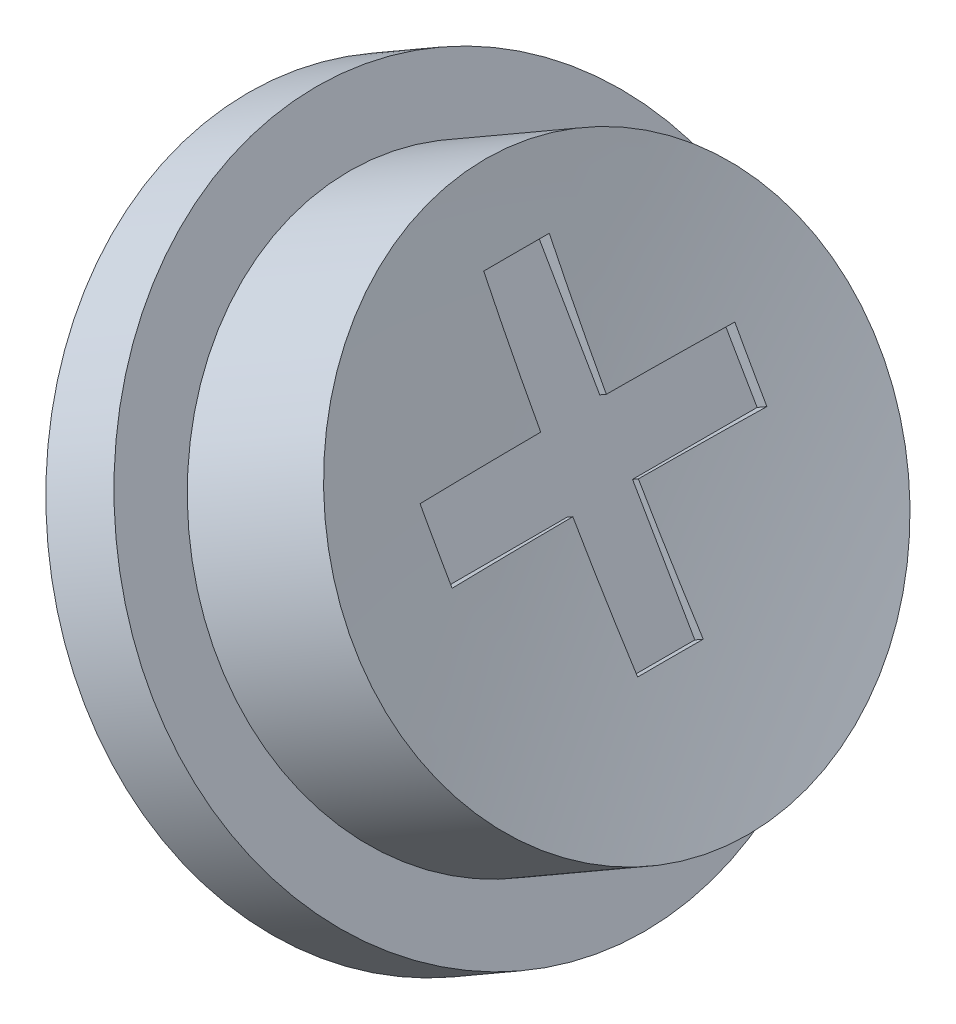
ISO-10303-21;
HEADER;
FILE_DESCRIPTION(('STEP AP214'),'2;1');
FILE_NAME('part.step','',(''),(''),'','','');
FILE_SCHEMA(('AUTOMOTIVE_DESIGN { 1 0 10303 214 1 1 1 1 }'));
ENDSEC;
DATA;
#1=APPLICATION_CONTEXT('core data for automotive mechanical design processes');
#2=APPLICATION_PROTOCOL_DEFINITION('international standard','automotive_design',2000,#1);
#3=PRODUCT_CONTEXT('',#1,'mechanical');
#4=PRODUCT('Part','Part','',(#3));
#5=PRODUCT_RELATED_PRODUCT_CATEGORY('part','',(#4));
#6=PRODUCT_DEFINITION_FORMATION('','',#4);
#7=PRODUCT_DEFINITION_CONTEXT('part definition',#1,'design');
#8=PRODUCT_DEFINITION('design','',#6,#7);
#9=PRODUCT_DEFINITION_SHAPE('','',#8);
#10=(LENGTH_UNIT() NAMED_UNIT(*) SI_UNIT(.MILLI.,.METRE.));
#11=(NAMED_UNIT(*) PLANE_ANGLE_UNIT() SI_UNIT($,.RADIAN.));
#12=(NAMED_UNIT(*) SI_UNIT($,.STERADIAN.) SOLID_ANGLE_UNIT());
#13=UNCERTAINTY_MEASURE_WITH_UNIT(LENGTH_MEASURE(1.E-05),#10,'distance_accuracy_value','');
#14=(GEOMETRIC_REPRESENTATION_CONTEXT(3) GLOBAL_UNCERTAINTY_ASSIGNED_CONTEXT((#13)) GLOBAL_UNIT_ASSIGNED_CONTEXT((#10,
#11,#12)) REPRESENTATION_CONTEXT('',''));
#15=CARTESIAN_POINT('',(0.,0.,0.));
#16=DIRECTION('',(0.,0.,1.));
#17=DIRECTION('',(1.,0.,0.));
#18=AXIS2_PLACEMENT_3D('',#15,#16,#17);
#19=CARTESIAN_POINT('',(54.5272413359522,-75.443952390439,0.));
#20=DIRECTION('',(-0.866025403784438,-0.500000000000001,0.));
#21=DIRECTION('',(0.500000000000001,-0.866025403784438,0.));
#22=AXIS2_PLACEMENT_3D('',#19,#20,#21);
#23=PLANE('',#22);
#24=CARTESIAN_POINT('',(54.5272413359522,-75.443952390439,0.));
#25=DIRECTION('',(0.866025403784438,0.500000000000001,0.));
#26=DIRECTION('',(-0.500000000000001,0.866025403784438,0.));
#27=AXIS2_PLACEMENT_3D('',#24,#25,#26);
#28=CIRCLE('',#27,2.);
#29=CARTESIAN_POINT('',(53.5272413359522,-73.7119015828702,0.));
#30=VERTEX_POINT('',#29);
#31=EDGE_CURVE('E219',#30,#30,#28,.T.);
#32=ORIENTED_EDGE('',*,*,#31,.F.);
#33=EDGE_LOOP('',(#32));
#34=FACE_BOUND('',#33,.T.);
#35=ADVANCED_FACE('F36',(#34),#23,.T.);
#36=CARTESIAN_POINT('',(59.7233937586588,-72.4439523904391,0.));
#37=DIRECTION('',(0.866025403784438,0.500000000000001,0.));
#38=DIRECTION('',(-0.500000000000001,0.866025403784438,0.));
#39=AXIS2_PLACEMENT_3D('',#36,#37,#38);
#40=CYLINDRICAL_SURFACE('',#39,2.);
#41=CARTESIAN_POINT('',(58.4243556529822,-73.1939523904391,0.));
#42=DIRECTION('',(0.866025403784438,0.500000000000001,0.));
#43=DIRECTION('',(-0.500000000000001,0.866025403784438,0.));
#44=AXIS2_PLACEMENT_3D('',#41,#42,#43);
#45=CIRCLE('',#44,1.99999999999999);
#46=CARTESIAN_POINT('',(57.4243556529822,-71.4619015828702,0.));
#47=VERTEX_POINT('',#46);
#48=EDGE_CURVE('E216',#47,#47,#45,.T.);
#49=CARTESIAN_POINT('',(53.5272413359522,-73.7119015828702,0.));
#50=CARTESIAN_POINT('',(53.5678362767546,-73.6884640828702,0.));
#51=CARTESIAN_POINT('',(53.608431217557,-73.6650265828702,0.));
#52=CARTESIAN_POINT('',(53.6896210991618,-73.6181515828702,0.));
#53=CARTESIAN_POINT('',(53.7302160399642,-73.5947140828702,0.));
#54=CARTESIAN_POINT('',(53.811405921569,-73.5478390828702,0.));
#55=CARTESIAN_POINT('',(53.8520008623714,-73.5244015828702,0.));
#56=CARTESIAN_POINT('',(53.9331907439762,-73.4775265828702,0.));
#57=CARTESIAN_POINT('',(53.9737856847786,-73.4540890828702,0.));
#58=CARTESIAN_POINT('',(54.0549755663834,-73.4072140828702,0.));
#59=CARTESIAN_POINT('',(54.0955705071858,-73.3837765828702,0.));
#60=CARTESIAN_POINT('',(54.1767603887906,-73.3369015828702,0.));
#61=CARTESIAN_POINT('',(54.217355329593,-73.3134640828702,0.));
#62=CARTESIAN_POINT('',(54.2985452111977,-73.2665890828702,0.));
#63=CARTESIAN_POINT('',(54.3391401520001,-73.2431515828702,0.));
#64=CARTESIAN_POINT('',(54.4203300336049,-73.1962765828702,0.));
#65=CARTESIAN_POINT('',(54.4609249744073,-73.1728390828702,0.));
#66=CARTESIAN_POINT('',(54.5421148560121,-73.1259640828702,0.));
#67=CARTESIAN_POINT('',(54.5827097968145,-73.1025265828702,0.));
#68=CARTESIAN_POINT('',(54.6638996784193,-73.0556515828702,0.));
#69=CARTESIAN_POINT('',(54.7044946192217,-73.0322140828702,0.));
#70=CARTESIAN_POINT('',(54.7856845008265,-72.9853390828702,0.));
#71=CARTESIAN_POINT('',(54.8262794416289,-72.9619015828702,0.));
#72=CARTESIAN_POINT('',(54.9074693232337,-72.9150265828702,0.));
#73=CARTESIAN_POINT('',(54.9480642640361,-72.8915890828702,0.));
#74=CARTESIAN_POINT('',(55.0292541456409,-72.8447140828702,0.));
#75=CARTESIAN_POINT('',(55.0698490864432,-72.8212765828702,0.));
#76=CARTESIAN_POINT('',(55.151038968048,-72.7744015828702,0.));
#77=CARTESIAN_POINT('',(55.1916339088504,-72.7509640828702,0.));
#78=CARTESIAN_POINT('',(55.2728237904552,-72.7040890828702,0.));
#79=CARTESIAN_POINT('',(55.3134187312576,-72.6806515828702,0.));
#80=CARTESIAN_POINT('',(55.3946086128624,-72.6337765828702,0.));
#81=CARTESIAN_POINT('',(55.4352035536648,-72.6103390828702,0.));
#82=CARTESIAN_POINT('',(55.5163934352696,-72.5634640828702,0.));
#83=CARTESIAN_POINT('',(55.556988376072,-72.5400265828702,0.));
#84=CARTESIAN_POINT('',(55.6381782576768,-72.4931515828702,0.));
#85=CARTESIAN_POINT('',(55.6787731984792,-72.4697140828702,0.));
#86=CARTESIAN_POINT('',(55.759963080084,-72.4228390828702,0.));
#87=CARTESIAN_POINT('',(55.8005580208864,-72.3994015828702,0.));
#88=CARTESIAN_POINT('',(55.8817479024911,-72.3525265828702,0.));
#89=CARTESIAN_POINT('',(55.9223428432935,-72.3290890828702,0.));
#90=CARTESIAN_POINT('',(56.0035327248983,-72.2822140828702,0.));
#91=CARTESIAN_POINT('',(56.0441276657007,-72.2587765828702,0.));
#92=CARTESIAN_POINT('',(56.1253175473055,-72.2119015828702,0.));
#93=CARTESIAN_POINT('',(56.1659124881079,-72.1884640828702,0.));
#94=CARTESIAN_POINT('',(56.2471023697127,-72.1415890828702,0.));
#95=CARTESIAN_POINT('',(56.2876973105151,-72.1181515828702,0.));
#96=CARTESIAN_POINT('',(56.3688871921199,-72.0712765828702,0.));
#97=CARTESIAN_POINT('',(56.4094821329223,-72.0478390828702,0.));
#98=CARTESIAN_POINT('',(56.4906720145271,-72.0009640828702,0.));
#99=CARTESIAN_POINT('',(56.5312669553295,-71.9775265828702,0.));
#100=CARTESIAN_POINT('',(56.6124568369343,-71.9306515828702,0.));
#101=CARTESIAN_POINT('',(56.6530517777367,-71.9072140828702,0.));
#102=CARTESIAN_POINT('',(56.7342416593414,-71.8603390828702,0.));
#103=CARTESIAN_POINT('',(56.7748366001438,-71.8369015828702,0.));
#104=CARTESIAN_POINT('',(56.8560264817486,-71.7900265828702,0.));
#105=CARTESIAN_POINT('',(56.896621422551,-71.7665890828702,0.));
#106=CARTESIAN_POINT('',(56.9778113041558,-71.7197140828702,0.));
#107=CARTESIAN_POINT('',(57.0184062449582,-71.6962765828702,0.));
#108=CARTESIAN_POINT('',(57.099596126563,-71.6494015828702,0.));
#109=CARTESIAN_POINT('',(57.1401910673654,-71.6259640828702,0.));
#110=CARTESIAN_POINT('',(57.2213809489702,-71.5790890828702,0.));
#111=CARTESIAN_POINT('',(57.2619758897726,-71.5556515828702,0.));
#112=CARTESIAN_POINT('',(57.3431657713774,-71.5087765828702,0.));
#113=CARTESIAN_POINT('',(57.3837607121798,-71.4853390828702,0.));
#114=CARTESIAN_POINT('',(57.4243556529822,-71.4619015828702,0.));
#115=B_SPLINE_CURVE_WITH_KNOTS('',3,(#49,#50,#51,#52,#53,#54,#55,#56,#57,#58,#59,#60,#61,#62,
#63,#64,#65,#66,#67,#68,#69,#70,#71,#72,#73,#74,#75,#76,#77,#78,#79,#80,#81,#82,#83,#84,#85,#86,
#87,#88,#89,#90,#91,#92,#93,#94,#95,#96,#97,#98,#99,#100,#101,#102,#103,#104,#105,#106,#107,
#108,#109,#110,#111,#112,#113,#114),.UNSPECIFIED.,.F.,.F.,(4,2,2,2,2,2,2,2,2,2,2,2,2,2,2,2,2,2,
2,2,2,2,2,2,2,2,2,2,2,2,2,2,4),(0.,0.140624999999999,0.281249999999998,0.42187499999999,
0.562499999999988,0.703124999999993,0.843749999999992,0.984374999999984,1.12499999999998,
1.26562499999998,1.40624999999999,1.54687499999999,1.68749999999998,1.82812499999998,
1.96874999999998,2.10937499999998,2.24999999999997,2.39062499999997,2.53124999999997,
2.67187499999997,2.81249999999997,2.95312499999996,3.09374999999996,3.23437499999997,
3.37499999999996,3.51562499999996,3.65624999999996,3.79687499999996,3.93749999999996,
4.07812499999995,4.21874999999995,4.35937499999995,4.49999999999996),.UNSPECIFIED.);
#116=EDGE_CURVE('BSEAM290',#30,#47,#115,.T.);
#117=ORIENTED_EDGE('',*,*,#31,.T.);
#118=ORIENTED_EDGE('',*,*,#48,.F.);
#119=ORIENTED_EDGE('',*,*,#116,.T.);
#120=ORIENTED_EDGE('',*,*,#116,.F.);
#121=EDGE_LOOP('',(#117,#119,#118,#120));
#122=FACE_BOUND('',#121,.T.);
#123=ADVANCED_FACE('F290',(#122),#40,.T.);
#124=CARTESIAN_POINT('',(57.4243556529822,-71.4619015828702,0.));
#125=DIRECTION('',(-0.866025403784438,-0.500000000000001,0.));
#126=DIRECTION('',(0.500000000000001,-0.866025403784438,0.));
#127=AXIS2_PLACEMENT_3D('',#124,#125,#126);
#128=PLANE('',#127);
#129=ORIENTED_EDGE('',*,*,#48,.T.);
#130=EDGE_LOOP('',(#129));
#131=FACE_BOUND('',#130,.T.);
#132=CARTESIAN_POINT('',(58.4243556529822,-73.1939523904391,0.));
#133=DIRECTION('',(0.866025403784438,0.500000000000001,0.));
#134=DIRECTION('',(-0.500000000000001,0.866025403784438,0.));
#135=AXIS2_PLACEMENT_3D('',#132,#133,#134);
#136=CIRCLE('',#135,3.00000000000005);
#137=CARTESIAN_POINT('',(56.9243556529821,-70.5958761790857,0.));
#138=VERTEX_POINT('',#137);
#139=EDGE_CURVE('E213',#138,#138,#136,.T.);
#140=ORIENTED_EDGE('',*,*,#139,.F.);
#141=EDGE_LOOP('',(#140));
#142=FACE_BOUND('',#141,.T.);
#143=ADVANCED_FACE('F295',(#131,#142),#128,.T.);
#144=CARTESIAN_POINT('',(59.7233937586588,-72.4439523904391,0.));
#145=DIRECTION('',(0.866025403784438,0.500000000000001,0.));
#146=DIRECTION('',(-0.500000000000001,0.866025403784438,0.));
#147=AXIS2_PLACEMENT_3D('',#144,#145,#146);
#148=CYLINDRICAL_SURFACE('',#147,3.00000000000006);
#149=CARTESIAN_POINT('',(56.6057023050349,-74.243952390439,0.));
#150=DIRECTION('',(0.866025403784438,0.500000000000001,0.));
#151=DIRECTION('',(-0.500000000000001,0.866025403784438,0.));
#152=AXIS2_PLACEMENT_3D('',#149,#150,#151);
#153=CIRCLE('',#152,3.00000000000007);
#154=CARTESIAN_POINT('',(55.1057023050348,-71.6458761790857,0.));
#155=VERTEX_POINT('',#154);
#156=EDGE_CURVE('E210',#155,#155,#153,.T.);
#157=CARTESIAN_POINT('',(56.9243556529821,-70.5958761790857,0.));
#158=CARTESIAN_POINT('',(56.9054113472744,-70.6068136790857,0.));
#159=CARTESIAN_POINT('',(56.8864670415666,-70.6177511790857,0.));
#160=CARTESIAN_POINT('',(56.848578430151,-70.6396261790857,0.));
#161=CARTESIAN_POINT('',(56.8296341244432,-70.6505636790857,0.));
#162=CARTESIAN_POINT('',(56.7917455130276,-70.6724386790857,0.));
#163=CARTESIAN_POINT('',(56.7728012073199,-70.6833761790857,0.));
#164=CARTESIAN_POINT('',(56.7349125959043,-70.7052511790857,0.));
#165=CARTESIAN_POINT('',(56.7159682901965,-70.7161886790857,0.));
#166=CARTESIAN_POINT('',(56.6780796787809,-70.7380636790857,0.));
#167=CARTESIAN_POINT('',(56.6591353730731,-70.7490011790857,0.));
#168=CARTESIAN_POINT('',(56.6212467616576,-70.7708761790857,0.));
#169=CARTESIAN_POINT('',(56.6023024559498,-70.7818136790857,0.));
#170=CARTESIAN_POINT('',(56.5644138445342,-70.8036886790857,0.));
#171=CARTESIAN_POINT('',(56.5454695388264,-70.8146261790857,0.));
#172=CARTESIAN_POINT('',(56.5075809274109,-70.8365011790857,0.));
#173=CARTESIAN_POINT('',(56.4886366217031,-70.8474386790857,0.));
#174=CARTESIAN_POINT('',(56.4507480102875,-70.8693136790857,0.));
#175=CARTESIAN_POINT('',(56.4318037045797,-70.8802511790857,0.));
#176=CARTESIAN_POINT('',(56.3939150931642,-70.9021261790857,0.));
#177=CARTESIAN_POINT('',(56.3749707874564,-70.9130636790857,0.));
#178=CARTESIAN_POINT('',(56.3370821760408,-70.9349386790857,0.));
#179=CARTESIAN_POINT('',(56.318137870333,-70.9458761790857,0.));
#180=CARTESIAN_POINT('',(56.2802492589175,-70.9677511790857,0.));
#181=CARTESIAN_POINT('',(56.2613049532097,-70.9786886790857,0.));
#182=CARTESIAN_POINT('',(56.2234163417941,-71.0005636790857,0.));
#183=CARTESIAN_POINT('',(56.2044720360863,-71.0115011790857,0.));
#184=CARTESIAN_POINT('',(56.1665834246708,-71.0333761790857,0.));
#185=CARTESIAN_POINT('',(56.147639118963,-71.0443136790857,0.));
#186=CARTESIAN_POINT('',(56.1097505075474,-71.0661886790857,0.));
#187=CARTESIAN_POINT('',(56.0908062018396,-71.0771261790857,0.));
#188=CARTESIAN_POINT('',(56.052917590424,-71.0990011790857,0.));
#189=CARTESIAN_POINT('',(56.0339732847163,-71.1099386790857,0.));
#190=CARTESIAN_POINT('',(55.9960846733007,-71.1318136790857,0.));
#191=CARTESIAN_POINT('',(55.9771403675929,-71.1427511790857,0.));
#192=CARTESIAN_POINT('',(55.9392517561773,-71.1646261790857,0.));
#193=CARTESIAN_POINT('',(55.9203074504696,-71.1755636790857,0.));
#194=CARTESIAN_POINT('',(55.882418839054,-71.1974386790857,0.));
#195=CARTESIAN_POINT('',(55.8634745333462,-71.2083761790857,0.));
#196=CARTESIAN_POINT('',(55.8255859219306,-71.2302511790857,0.));
#197=CARTESIAN_POINT('',(55.8066416162228,-71.2411886790857,0.));
#198=CARTESIAN_POINT('',(55.7687530048073,-71.2630636790857,0.));
#199=CARTESIAN_POINT('',(55.7498086990995,-71.2740011790857,0.));
#200=CARTESIAN_POINT('',(55.7119200876839,-71.2958761790857,0.));
#201=CARTESIAN_POINT('',(55.6929757819761,-71.3068136790857,0.));
#202=CARTESIAN_POINT('',(55.6550871705606,-71.3286886790857,0.));
#203=CARTESIAN_POINT('',(55.6361428648528,-71.3396261790857,0.));
#204=CARTESIAN_POINT('',(55.5982542534372,-71.3615011790857,0.));
#205=CARTESIAN_POINT('',(55.5793099477294,-71.3724386790857,0.));
#206=CARTESIAN_POINT('',(55.5414213363139,-71.3943136790857,0.));
#207=CARTESIAN_POINT('',(55.5224770306061,-71.4052511790857,0.));
#208=CARTESIAN_POINT('',(55.4845884191905,-71.4271261790857,0.));
#209=CARTESIAN_POINT('',(55.4656441134827,-71.4380636790857,0.));
#210=CARTESIAN_POINT('',(55.4277555020672,-71.4599386790857,0.));
#211=CARTESIAN_POINT('',(55.4088111963594,-71.4708761790857,0.));
#212=CARTESIAN_POINT('',(55.3709225849438,-71.4927511790857,0.));
#213=CARTESIAN_POINT('',(55.351978279236,-71.5036886790857,0.));
#214=CARTESIAN_POINT('',(55.3140896678204,-71.5255636790857,0.));
#215=CARTESIAN_POINT('',(55.2951453621127,-71.5365011790857,0.));
#216=CARTESIAN_POINT('',(55.2572567506971,-71.5583761790857,0.));
#217=CARTESIAN_POINT('',(55.2383124449893,-71.5693136790857,0.));
#218=CARTESIAN_POINT('',(55.2004238335737,-71.5911886790857,0.));
#219=CARTESIAN_POINT('',(55.181479527866,-71.6021261790857,0.));
#220=CARTESIAN_POINT('',(55.1435909164504,-71.6240011790857,0.));
#221=CARTESIAN_POINT('',(55.1246466107426,-71.6349386790857,0.));
#222=CARTESIAN_POINT('',(55.1057023050348,-71.6458761790857,0.));
#223=B_SPLINE_CURVE_WITH_KNOTS('',3,(#157,#158,#159,#160,#161,#162,#163,#164,#165,#166,#167,
#168,#169,#170,#171,#172,#173,#174,#175,#176,#177,#178,#179,#180,#181,#182,#183,#184,#185,#186,
#187,#188,#189,#190,#191,#192,#193,#194,#195,#196,#197,#198,#199,#200,#201,#202,#203,#204,#205,
#206,#207,#208,#209,#210,#211,#212,#213,#214,#215,#216,#217,#218,#219,#220,#221,#222),
.UNSPECIFIED.,.F.,.F.,(4,2,2,2,2,2,2,2,2,2,2,2,2,2,2,2,2,2,2,2,2,2,2,2,2,2,2,2,2,2,2,2,4),(0.,
0.0656250000000054,0.131250000000004,0.196875000000003,0.262500000000002,0.328125000000007,
0.39375,0.459375000000005,0.524999999999998,0.590625000000003,0.656250000000002,
0.721875000000001,0.7875,0.853124999999999,0.918749999999998,0.984375000000003,1.05,1.115625,
1.18124999999999,1.246875,1.3125,1.378125,1.44374999999999,1.509375,1.57499999999999,1.640625,
1.70624999999999,1.771875,1.83749999999999,1.90312499999999,1.96874999999999,2.03437499999999,
2.09999999999999),.UNSPECIFIED.);
#224=EDGE_CURVE('BSEAM302',#138,#155,#223,.T.);
#225=ORIENTED_EDGE('',*,*,#139,.T.);
#226=ORIENTED_EDGE('',*,*,#156,.F.);
#227=ORIENTED_EDGE('',*,*,#224,.T.);
#228=ORIENTED_EDGE('',*,*,#224,.F.);
#229=EDGE_LOOP('',(#225,#227,#226,#228));
#230=FACE_BOUND('',#229,.T.);
#231=ADVANCED_FACE('F302',(#230),#148,.F.);
#232=CARTESIAN_POINT('',(55.1057023050348,-71.6458761790857,0.));
#233=DIRECTION('',(-0.866025403784438,-0.500000000000001,0.));
#234=DIRECTION('',(0.500000000000001,-0.866025403784438,0.));
#235=AXIS2_PLACEMENT_3D('',#232,#233,#234);
#236=PLANE('',#235);
#237=ORIENTED_EDGE('',*,*,#156,.T.);
#238=EDGE_LOOP('',(#237));
#239=FACE_BOUND('',#238,.T.);
#240=CARTESIAN_POINT('',(56.6057023050349,-74.243952390439,0.));
#241=DIRECTION('',(0.866025403784438,0.500000000000001,0.));
#242=DIRECTION('',(-0.500000000000001,0.866025403784438,0.));
#243=AXIS2_PLACEMENT_3D('',#240,#241,#242);
#244=CIRCLE('',#243,5.00000000000007);
#245=CARTESIAN_POINT('',(54.1057023050348,-69.9138253715168,0.));
#246=VERTEX_POINT('',#245);
#247=EDGE_CURVE('E207',#246,#246,#244,.T.);
#248=ORIENTED_EDGE('',*,*,#247,.F.);
#249=EDGE_LOOP('',(#248));
#250=FACE_BOUND('',#249,.T.);
#251=ADVANCED_FACE('F306',(#239,#250),#236,.T.);
#252=CARTESIAN_POINT('',(59.7233937586588,-72.4439523904391,0.));
#253=DIRECTION('',(0.866025403784438,0.500000000000001,0.));
#254=DIRECTION('',(-0.500000000000001,0.866025403784438,0.));
#255=AXIS2_PLACEMENT_3D('',#252,#253,#254);
#256=CYLINDRICAL_SURFACE('',#255,5.00000000000007);
#257=CARTESIAN_POINT('',(57.6449327895762,-73.6439523904391,0.));
#258=DIRECTION('',(0.866025403784438,0.500000000000001,0.));
#259=DIRECTION('',(-0.500000000000001,0.866025403784438,0.));
#260=AXIS2_PLACEMENT_3D('',#257,#258,#259);
#261=CIRCLE('',#260,5.00000000000007);
#262=CARTESIAN_POINT('',(55.1449327895761,-69.3138253715168,0.));
#263=VERTEX_POINT('',#262);
#264=EDGE_CURVE('E204',#263,#263,#261,.T.);
#265=CARTESIAN_POINT('',(54.1057023050348,-69.9138253715168,0.));
#266=CARTESIAN_POINT('',(54.1165276225821,-69.9075753715168,0.));
#267=CARTESIAN_POINT('',(54.1273529401294,-69.9013253715168,0.));
#268=CARTESIAN_POINT('',(54.149003575224,-69.8888253715168,0.));
#269=CARTESIAN_POINT('',(54.1598288927713,-69.8825753715168,0.));
#270=CARTESIAN_POINT('',(54.181479527866,-69.8700753715168,0.));
#271=CARTESIAN_POINT('',(54.1923048454133,-69.8638253715168,0.));
#272=CARTESIAN_POINT('',(54.2139554805079,-69.8513253715168,0.));
#273=CARTESIAN_POINT('',(54.2247807980552,-69.8450753715168,0.));
#274=CARTESIAN_POINT('',(54.2464314331498,-69.8325753715168,0.));
#275=CARTESIAN_POINT('',(54.2572567506971,-69.8263253715168,0.));
#276=CARTESIAN_POINT('',(54.2789073857917,-69.8138253715168,0.));
#277=CARTESIAN_POINT('',(54.289732703339,-69.8075753715168,0.));
#278=CARTESIAN_POINT('',(54.3113833384336,-69.7950753715168,0.));
#279=CARTESIAN_POINT('',(54.3222086559809,-69.7888253715168,0.));
#280=CARTESIAN_POINT('',(54.3438592910755,-69.7763253715168,0.));
#281=CARTESIAN_POINT('',(54.3546846086228,-69.7700753715168,0.));
#282=CARTESIAN_POINT('',(54.3763352437175,-69.7575753715168,0.));
#283=CARTESIAN_POINT('',(54.3871605612648,-69.7513253715168,0.));
#284=CARTESIAN_POINT('',(54.4088111963594,-69.7388253715168,0.));
#285=CARTESIAN_POINT('',(54.4196365139067,-69.7325753715168,0.));
#286=CARTESIAN_POINT('',(54.4412871490013,-69.7200753715168,0.));
#287=CARTESIAN_POINT('',(54.4521124665486,-69.7138253715168,0.));
#288=CARTESIAN_POINT('',(54.4737631016432,-69.7013253715168,0.));
#289=CARTESIAN_POINT('',(54.4845884191905,-69.6950753715168,0.));
#290=CARTESIAN_POINT('',(54.5062390542851,-69.6825753715168,0.));
#291=CARTESIAN_POINT('',(54.5170643718324,-69.6763253715168,0.));
#292=CARTESIAN_POINT('',(54.538715006927,-69.6638253715168,0.));
#293=CARTESIAN_POINT('',(54.5495403244743,-69.6575753715168,0.));
#294=CARTESIAN_POINT('',(54.5711909595689,-69.6450753715168,0.));
#295=CARTESIAN_POINT('',(54.5820162771163,-69.6388253715168,0.));
#296=CARTESIAN_POINT('',(54.6036669122109,-69.6263253715168,0.));
#297=CARTESIAN_POINT('',(54.6144922297582,-69.6200753715168,0.));
#298=CARTESIAN_POINT('',(54.6361428648528,-69.6075753715168,0.));
#299=CARTESIAN_POINT('',(54.6469681824001,-69.6013253715168,0.));
#300=CARTESIAN_POINT('',(54.6686188174947,-69.5888253715168,0.));
#301=CARTESIAN_POINT('',(54.679444135042,-69.5825753715168,0.));
#302=CARTESIAN_POINT('',(54.7010947701366,-69.5700753715168,0.));
#303=CARTESIAN_POINT('',(54.7119200876839,-69.5638253715168,0.));
#304=CARTESIAN_POINT('',(54.7335707227785,-69.5513253715168,0.));
#305=CARTESIAN_POINT('',(54.7443960403258,-69.5450753715168,0.));
#306=CARTESIAN_POINT('',(54.7660466754204,-69.5325753715168,0.));
#307=CARTESIAN_POINT('',(54.7768719929678,-69.5263253715168,0.));
#308=CARTESIAN_POINT('',(54.7985226280624,-69.5138253715168,0.));
#309=CARTESIAN_POINT('',(54.8093479456097,-69.5075753715168,0.));
#310=CARTESIAN_POINT('',(54.8309985807043,-69.4950753715168,0.));
#311=CARTESIAN_POINT('',(54.8418238982516,-69.4888253715168,0.));
#312=CARTESIAN_POINT('',(54.8634745333462,-69.4763253715168,0.));
#313=CARTESIAN_POINT('',(54.8742998508935,-69.4700753715168,0.));
#314=CARTESIAN_POINT('',(54.8959504859881,-69.4575753715168,0.));
#315=CARTESIAN_POINT('',(54.9067758035354,-69.4513253715168,0.));
#316=CARTESIAN_POINT('',(54.92842643863,-69.4388253715168,0.));
#317=CARTESIAN_POINT('',(54.9392517561773,-69.4325753715168,0.));
#318=CARTESIAN_POINT('',(54.9609023912719,-69.4200753715168,0.));
#319=CARTESIAN_POINT('',(54.9717277088193,-69.4138253715168,0.));
#320=CARTESIAN_POINT('',(54.9933783439139,-69.4013253715168,0.));
#321=CARTESIAN_POINT('',(55.0042036614612,-69.3950753715168,0.));
#322=CARTESIAN_POINT('',(55.0258542965558,-69.3825753715168,0.));
#323=CARTESIAN_POINT('',(55.0366796141031,-69.3763253715168,0.));
#324=CARTESIAN_POINT('',(55.0583302491977,-69.3638253715168,0.));
#325=CARTESIAN_POINT('',(55.069155566745,-69.3575753715168,0.));
#326=CARTESIAN_POINT('',(55.0908062018396,-69.3450753715168,0.));
#327=CARTESIAN_POINT('',(55.1016315193869,-69.3388253715168,0.));
#328=CARTESIAN_POINT('',(55.1232821544815,-69.3263253715168,0.));
#329=CARTESIAN_POINT('',(55.1341074720288,-69.3200753715168,0.));
#330=CARTESIAN_POINT('',(55.1449327895761,-69.3138253715168,0.));
#331=B_SPLINE_CURVE_WITH_KNOTS('',3,(#265,#266,#267,#268,#269,#270,#271,#272,#273,#274,#275,
#276,#277,#278,#279,#280,#281,#282,#283,#284,#285,#286,#287,#288,#289,#290,#291,#292,#293,#294,
#295,#296,#297,#298,#299,#300,#301,#302,#303,#304,#305,#306,#307,#308,#309,#310,#311,#312,#313,
#314,#315,#316,#317,#318,#319,#320,#321,#322,#323,#324,#325,#326,#327,#328,#329,#330),
.UNSPECIFIED.,.F.,.F.,(4,2,2,2,2,2,2,2,2,2,2,2,2,2,2,2,2,2,2,2,2,2,2,2,2,2,2,2,2,2,2,2,4),(0.,
0.0374999999999967,0.0749999999999994,0.112499999999996,0.149999999999993,0.187499999999996,
0.224999999999992,0.262500000000002,0.299999999999998,0.337499999999995,0.374999999999998,
0.412499999999995,0.449999999999991,0.487499999999994,0.524999999999998,0.562499999999994,
0.599999999999997,0.637499999999994,0.674999999999996,0.712499999999993,0.74999999999999,0.7875,
0.824999999999996,0.862499999999993,0.899999999999996,0.937499999999992,0.974999999999989,
1.01249999999999,1.05,1.08749999999999,1.125,1.16249999999999,1.19999999999999),.UNSPECIFIED.);
#332=EDGE_CURVE('BSEAM310',#246,#263,#331,.T.);
#333=ORIENTED_EDGE('',*,*,#247,.T.);
#334=ORIENTED_EDGE('',*,*,#264,.F.);
#335=ORIENTED_EDGE('',*,*,#332,.T.);
#336=ORIENTED_EDGE('',*,*,#332,.F.);
#337=EDGE_LOOP('',(#333,#335,#334,#336));
#338=FACE_BOUND('',#337,.T.);
#339=ADVANCED_FACE('F310',(#338),#256,.T.);
#340=CARTESIAN_POINT('',(55.1449327895761,-69.3138253715168,0.));
#341=DIRECTION('',(0.866025403784438,0.500000000000001,0.));
#342=DIRECTION('',(-0.500000000000001,0.866025403784438,0.));
#343=AXIS2_PLACEMENT_3D('',#340,#341,#342);
#344=PLANE('',#343);
#345=ORIENTED_EDGE('',*,*,#264,.T.);
#346=EDGE_LOOP('',(#345));
#347=FACE_BOUND('',#346,.T.);
#348=CARTESIAN_POINT('',(57.6449327895762,-73.643952390439,0.));
#349=DIRECTION('',(0.866025403784438,0.500000000000001,0.));
#350=DIRECTION('',(-0.500000000000001,0.866025403784438,0.));
#351=AXIS2_PLACEMENT_3D('',#348,#349,#350);
#352=CIRCLE('',#351,4.00000000000006);
#353=CARTESIAN_POINT('',(55.6449327895762,-70.1798507753013,0.));
#354=VERTEX_POINT('',#353);
#355=EDGE_CURVE('E201',#354,#354,#352,.T.);
#356=ORIENTED_EDGE('',*,*,#355,.F.);
#357=EDGE_LOOP('',(#356));
#358=FACE_BOUND('',#357,.T.);
#359=ADVANCED_FACE('F314',(#347,#358),#344,.T.);
#360=CARTESIAN_POINT('',(59.7233937586588,-72.4439523904391,0.));
#361=DIRECTION('',(0.866025403784438,0.500000000000001,0.));
#362=DIRECTION('',(-0.500000000000001,0.866025403784438,0.));
#363=AXIS2_PLACEMENT_3D('',#360,#361,#362);
#364=CYLINDRICAL_SURFACE('',#363,4.00000000000004);
#365=CARTESIAN_POINT('',(59.7233937586588,-72.4439523904391,0.));
#366=DIRECTION('',(0.866025403784438,0.500000000000001,0.));
#367=DIRECTION('',(-0.500000000000001,0.866025403784438,0.));
#368=AXIS2_PLACEMENT_3D('',#365,#366,#367);
#369=CIRCLE('',#368,4.00000000000002);
#370=CARTESIAN_POINT('',(57.7233937586588,-68.9798507753013,0.));
#371=VERTEX_POINT('',#370);
#372=EDGE_CURVE('E173',#371,#371,#369,.T.);
#373=CARTESIAN_POINT('',(55.6449327895762,-70.1798507753013,0.));
#374=CARTESIAN_POINT('',(55.6665834246708,-70.1673507753013,0.));
#375=CARTESIAN_POINT('',(55.6882340597654,-70.1548507753013,0.));
#376=CARTESIAN_POINT('',(55.7315353299546,-70.1298507753013,0.));
#377=CARTESIAN_POINT('',(55.7531859650492,-70.1173507753013,0.));
#378=CARTESIAN_POINT('',(55.7964872352384,-70.0923507753013,0.));
#379=CARTESIAN_POINT('',(55.8181378703331,-70.0798507753013,0.));
#380=CARTESIAN_POINT('',(55.8614391405223,-70.0548507753013,0.));
#381=CARTESIAN_POINT('',(55.8830897756169,-70.0423507753013,0.));
#382=CARTESIAN_POINT('',(55.9263910458061,-70.0173507753013,0.));
#383=CARTESIAN_POINT('',(55.9480416809007,-70.0048507753013,0.));
#384=CARTESIAN_POINT('',(55.9913429510899,-69.9798507753013,0.));
#385=CARTESIAN_POINT('',(56.0129935861845,-69.9673507753013,0.));
#386=CARTESIAN_POINT('',(56.0562948563738,-69.9423507753013,0.));
#387=CARTESIAN_POINT('',(56.0779454914684,-69.9298507753013,0.));
#388=CARTESIAN_POINT('',(56.1212467616576,-69.9048507753013,0.));
#389=CARTESIAN_POINT('',(56.1428973967522,-69.8923507753013,0.));
#390=CARTESIAN_POINT('',(56.1861986669414,-69.8673507753013,0.));
#391=CARTESIAN_POINT('',(56.207849302036,-69.8548507753013,0.));
#392=CARTESIAN_POINT('',(56.2511505722253,-69.8298507753013,0.));
#393=CARTESIAN_POINT('',(56.2728012073199,-69.8173507753013,0.));
#394=CARTESIAN_POINT('',(56.3161024775091,-69.7923507753013,0.));
#395=CARTESIAN_POINT('',(56.3377531126037,-69.7798507753013,0.));
#396=CARTESIAN_POINT('',(56.3810543827929,-69.7548507753013,0.));
#397=CARTESIAN_POINT('',(56.4027050178875,-69.7423507753013,0.));
#398=CARTESIAN_POINT('',(56.4460062880768,-69.7173507753013,0.));
#399=CARTESIAN_POINT('',(56.4676569231714,-69.7048507753013,0.));
#400=CARTESIAN_POINT('',(56.5109581933606,-69.6798507753013,0.));
#401=CARTESIAN_POINT('',(56.5326088284552,-69.6673507753013,0.));
#402=CARTESIAN_POINT('',(56.5759100986444,-69.6423507753013,0.));
#403=CARTESIAN_POINT('',(56.597560733739,-69.6298507753013,0.));
#404=CARTESIAN_POINT('',(56.6408620039283,-69.6048507753013,0.));
#405=CARTESIAN_POINT('',(56.6625126390229,-69.5923507753013,0.));
#406=CARTESIAN_POINT('',(56.7058139092121,-69.5673507753013,0.));
#407=CARTESIAN_POINT('',(56.7274645443067,-69.5548507753013,0.));
#408=CARTESIAN_POINT('',(56.7707658144959,-69.5298507753013,0.));
#409=CARTESIAN_POINT('',(56.7924164495905,-69.5173507753013,0.));
#410=CARTESIAN_POINT('',(56.8357177197798,-69.4923507753013,0.));
#411=CARTESIAN_POINT('',(56.8573683548744,-69.4798507753013,0.));
#412=CARTESIAN_POINT('',(56.9006696250636,-69.4548507753013,0.));
#413=CARTESIAN_POINT('',(56.9223202601582,-69.4423507753013,0.));
#414=CARTESIAN_POINT('',(56.9656215303474,-69.4173507753013,0.));
#415=CARTESIAN_POINT('',(56.987272165442,-69.4048507753013,0.));
#416=CARTESIAN_POINT('',(57.0305734356313,-69.3798507753013,0.));
#417=CARTESIAN_POINT('',(57.0522240707259,-69.3673507753013,0.));
#418=CARTESIAN_POINT('',(57.0955253409151,-69.3423507753013,0.));
#419=CARTESIAN_POINT('',(57.1171759760097,-69.3298507753013,0.));
#420=CARTESIAN_POINT('',(57.1604772461989,-69.3048507753013,0.));
#421=CARTESIAN_POINT('',(57.1821278812935,-69.2923507753013,0.));
#422=CARTESIAN_POINT('',(57.2254291514828,-69.2673507753013,0.));
#423=CARTESIAN_POINT('',(57.2470797865774,-69.2548507753013,0.));
#424=CARTESIAN_POINT('',(57.2903810567666,-69.2298507753013,0.));
#425=CARTESIAN_POINT('',(57.3120316918612,-69.2173507753013,0.));
#426=CARTESIAN_POINT('',(57.3553329620504,-69.1923507753013,0.));
#427=CARTESIAN_POINT('',(57.376983597145,-69.1798507753013,0.));
#428=CARTESIAN_POINT('',(57.4202848673343,-69.1548507753013,0.));
#429=CARTESIAN_POINT('',(57.4419355024289,-69.1423507753013,0.));
#430=CARTESIAN_POINT('',(57.4852367726181,-69.1173507753013,0.));
#431=CARTESIAN_POINT('',(57.5068874077127,-69.1048507753013,0.));
#432=CARTESIAN_POINT('',(57.5501886779019,-69.0798507753013,0.));
#433=CARTESIAN_POINT('',(57.5718393129965,-69.0673507753013,0.));
#434=CARTESIAN_POINT('',(57.6151405831857,-69.0423507753013,0.));
#435=CARTESIAN_POINT('',(57.6367912182804,-69.0298507753013,0.));
#436=CARTESIAN_POINT('',(57.6800924884696,-69.0048507753013,0.));
#437=CARTESIAN_POINT('',(57.7017431235642,-68.9923507753013,0.));
#438=CARTESIAN_POINT('',(57.7233937586588,-68.9798507753013,0.));
#439=B_SPLINE_CURVE_WITH_KNOTS('',3,(#373,#374,#375,#376,#377,#378,#379,#380,#381,#382,#383,
#384,#385,#386,#387,#388,#389,#390,#391,#392,#393,#394,#395,#396,#397,#398,#399,#400,#401,#402,
#403,#404,#405,#406,#407,#408,#409,#410,#411,#412,#413,#414,#415,#416,#417,#418,#419,#420,#421,
#422,#423,#424,#425,#426,#427,#428,#429,#430,#431,#432,#433,#434,#435,#436,#437,#438),
.UNSPECIFIED.,.F.,.F.,(4,2,2,2,2,2,2,2,2,2,2,2,2,2,2,2,2,2,2,2,2,2,2,2,2,2,2,2,2,2,2,2,4),(0.,
0.0750000000000003,0.15,0.224999999999999,0.299999999999999,0.374999999999999,0.449999999999998,
0.525000000000005,0.600000000000004,0.674999999999997,0.749999999999997,0.825000000000003,
0.900000000000003,0.974999999999996,1.05,1.125,1.2,1.275,1.35,1.425,1.5,1.575,1.65,1.725,1.8,
1.875,1.95,2.025,2.1,2.175,2.25,2.325,2.4),.UNSPECIFIED.);
#440=EDGE_CURVE('BSEAM318',#354,#371,#439,.T.);
#441=ORIENTED_EDGE('',*,*,#355,.T.);
#442=ORIENTED_EDGE('',*,*,#372,.F.);
#443=ORIENTED_EDGE('',*,*,#440,.T.);
#444=ORIENTED_EDGE('',*,*,#440,.F.);
#445=EDGE_LOOP('',(#441,#443,#442,#444));
#446=FACE_BOUND('',#445,.T.);
#447=ADVANCED_FACE('F318',(#446),#364,.T.);
#448=CARTESIAN_POINT('',(94.2778073696583,-52.4939523904377,0.));
#449=DIRECTION('',(0.,0.,1.));
#450=DIRECTION('',(1.,0.,0.));
#451=AXIS2_PLACEMENT_3D('',#448,#449,#450);
#452=SPHERICAL_SURFACE('',#451,40.100000000001);
#453=CARTESIAN_POINT('',(94.2778073696583,-52.4939523904377,2.4));
#454=DIRECTION('',(0.,0.,1.));
#455=DIRECTION('',(0.,-1.,0.));
#456=AXIS2_PLACEMENT_3D('',#453,#454,#455);
#457=CIRCLE('',#456,40.0281151192519);
#458=CARTESIAN_POINT('',(59.1232622132142,-71.6357379613715,2.4));
#459=VERTEX_POINT('',#458);
#460=CARTESIAN_POINT('',(59.6124428107787,-72.5080099500645,2.4));
#461=VERTEX_POINT('',#460);
#462=EDGE_CURVE('E11',#459,#461,#457,.T.);
#463=ORIENTED_EDGE('',*,*,#462,.F.);
#464=CARTESIAN_POINT('',(93.7778073696588,-51.6279269866542,0.));
#465=DIRECTION('',(-0.5,0.866025403784439,0.));
#466=DIRECTION('',(-0.866025403784439,-0.5,0.));
#467=AXIS2_PLACEMENT_3D('',#464,#465,#466);
#468=CIRCLE('',#467,40.0875292329183);
#469=CARTESIAN_POINT('',(59.0636892042774,-71.6701324541175,0.5));
#470=VERTEX_POINT('',#469);
#471=EDGE_CURVE('E44',#470,#459,#468,.T.);
#472=ORIENTED_EDGE('',*,*,#471,.F.);
#473=CARTESIAN_POINT('',(94.2778073696583,-52.4939523904377,0.5));
#474=DIRECTION('',(0.,0.,1.));
#475=DIRECTION('',(0.,-1.,0.));
#476=AXIS2_PLACEMENT_3D('',#473,#474,#475);
#477=CIRCLE('',#476,40.0968826718497);
#478=CARTESIAN_POINT('',(58.1938283894714,-69.9784158067827,0.5));
#479=VERTEX_POINT('',#478);
#480=EDGE_CURVE('E242',#479,#470,#477,.T.);
#481=ORIENTED_EDGE('',*,*,#480,.F.);
#482=CARTESIAN_POINT('',(92.8278073696588,-49.9824787194637,0.));
#483=DIRECTION('',(-0.5,0.866025403784439,0.));
#484=DIRECTION('',(-0.866025403784439,-0.5,0.));
#485=AXIS2_PLACEMENT_3D('',#482,#483,#484);
#486=CIRCLE('',#485,39.994999687462);
#487=CARTESIAN_POINT('',(58.1938283894714,-69.9784158067827,-0.5));
#488=VERTEX_POINT('',#487);
#489=EDGE_CURVE('E240',#488,#479,#486,.T.);
#490=ORIENTED_EDGE('',*,*,#489,.F.);
#491=CARTESIAN_POINT('',(94.2778073696583,-52.4939523904377,-0.5));
#492=DIRECTION('',(0.,0.,-1.));
#493=DIRECTION('',(0.,1.,0.));
#494=AXIS2_PLACEMENT_3D('',#491,#492,#493);
#495=CIRCLE('',#494,40.0968826718497);
#496=CARTESIAN_POINT('',(59.0636892042774,-71.6701324541175,-0.5));
#497=VERTEX_POINT('',#496);
#498=EDGE_CURVE('E238',#497,#488,#495,.T.);
#499=ORIENTED_EDGE('',*,*,#498,.F.);
#500=CARTESIAN_POINT('',(93.7778073696588,-51.6279269866542,0.));
#501=DIRECTION('',(-0.5,0.866025403784439,0.));
#502=DIRECTION('',(-0.866025403784439,-0.5,0.));
#503=AXIS2_PLACEMENT_3D('',#500,#501,#502);
#504=CIRCLE('',#503,40.0875292329183);
#505=CARTESIAN_POINT('',(59.1232622132142,-71.6357379613715,-2.4));
#506=VERTEX_POINT('',#505);
#507=EDGE_CURVE('E236',#506,#497,#504,.T.);
#508=ORIENTED_EDGE('',*,*,#507,.F.);
#509=CARTESIAN_POINT('',(94.2778073696583,-52.4939523904377,-2.4));
#510=DIRECTION('',(0.,0.,-1.));
#511=DIRECTION('',(0.,1.,0.));
#512=AXIS2_PLACEMENT_3D('',#509,#510,#511);
#513=CIRCLE('',#512,40.0281151192519);
#514=CARTESIAN_POINT('',(59.6124428107787,-72.5080099500645,-2.4));
#515=VERTEX_POINT('',#514);
#516=EDGE_CURVE('E234',#515,#506,#513,.T.);
#517=ORIENTED_EDGE('',*,*,#516,.F.);
#518=CARTESIAN_POINT('',(94.2778073696588,-52.4939523904386,0.));
#519=DIRECTION('',(0.5,-0.866025403784439,0.));
#520=DIRECTION('',(0.866025403784439,0.5,0.));
#521=AXIS2_PLACEMENT_3D('',#518,#519,#520);
#522=CIRCLE('',#521,40.100000000001);
#523=CARTESIAN_POINT('',(59.5528883632729,-72.5423937263634,-0.5));
#524=VERTEX_POINT('',#523);
#525=EDGE_CURVE('E232',#524,#515,#522,.T.);
#526=ORIENTED_EDGE('',*,*,#525,.F.);
#527=CARTESIAN_POINT('',(94.2778073696583,-52.4939523904377,-0.5));
#528=DIRECTION('',(0.,0.,-1.));
#529=DIRECTION('',(0.,1.,0.));
#530=AXIS2_PLACEMENT_3D('',#527,#528,#529);
#531=CIRCLE('',#530,40.0968826718497);
#532=CARTESIAN_POINT('',(60.5418952438395,-74.1653213605585,-0.5));
#533=VERTEX_POINT('',#532);
#534=EDGE_CURVE('E230',#533,#524,#531,.T.);
#535=ORIENTED_EDGE('',*,*,#534,.F.);
#536=CARTESIAN_POINT('',(95.2278073696588,-54.139400657629,0.));
#537=DIRECTION('',(0.5,-0.866025403784439,0.));
#538=DIRECTION('',(0.866025403784439,0.5,0.));
#539=AXIS2_PLACEMENT_3D('',#536,#537,#538);
#540=CIRCLE('',#539,40.0549622394039);
#541=CARTESIAN_POINT('',(60.5418952438395,-74.1653213605585,0.5));
#542=VERTEX_POINT('',#541);
#543=EDGE_CURVE('E228',#542,#533,#540,.T.);
#544=ORIENTED_EDGE('',*,*,#543,.F.);
#545=CARTESIAN_POINT('',(94.2778073696583,-52.4939523904377,0.5));
#546=DIRECTION('',(0.,0.,1.));
#547=DIRECTION('',(0.,-1.,0.));
#548=AXIS2_PLACEMENT_3D('',#545,#546,#547);
#549=CIRCLE('',#548,40.0968826718497);
#550=CARTESIAN_POINT('',(59.5528883632729,-72.5423937263634,0.5));
#551=VERTEX_POINT('',#550);
#552=EDGE_CURVE('E226',#551,#542,#549,.T.);
#553=ORIENTED_EDGE('',*,*,#552,.F.);
#554=CARTESIAN_POINT('',(94.2778073696588,-52.4939523904386,0.));
#555=DIRECTION('',(0.5,-0.866025403784439,0.));
#556=DIRECTION('',(0.866025403784439,0.5,0.));
#557=AXIS2_PLACEMENT_3D('',#554,#555,#556);
#558=CIRCLE('',#557,40.100000000001);
#559=EDGE_CURVE('E222',#461,#551,#558,.T.);
#560=ORIENTED_EDGE('',*,*,#559,.F.);
#561=EDGE_LOOP('',(#463,#472,#481,#490,#499,#508,#517,#526,#535,#544,#553,#560));
#562=FACE_BOUND('',#561,.T.);
#563=ORIENTED_EDGE('',*,*,#372,.T.);
#564=EDGE_LOOP('',(#563));
#565=FACE_BOUND('',#564,.T.);
#566=ADVANCED_FACE('F38',(#562,#565),#452,.F.);
#567=CARTESIAN_POINT('',(58.9635861375235,-71.7279269866547,2.4));
#568=DIRECTION('',(0.,0.,1.));
#569=DIRECTION('',(0.,-1.,0.));
#570=AXIS2_PLACEMENT_3D('',#567,#568,#569);
#571=PLANE('',#570);
#572=ORIENTED_EDGE('',*,*,#462,.T.);
#573=DIRECTION('',(0.866025403784439,0.5,0.));
#574=VECTOR('',#573,1.);
#575=CARTESIAN_POINT('',(59.4635861375235,-72.5939523904391,2.4));
#576=LINE('',#575,#574);
#577=CARTESIAN_POINT('',(59.4635861375235,-72.5939523904391,2.4));
#578=VERTEX_POINT('',#577);
#579=EDGE_CURVE('E51',#578,#461,#576,.T.);
#580=ORIENTED_EDGE('',*,*,#579,.F.);
#581=DIRECTION('',(0.499999999999998,-0.866025403784439,0.));
#582=VECTOR('',#581,1.);
#583=CARTESIAN_POINT('',(58.9635861375235,-71.7279269866547,2.4));
#584=LINE('',#583,#582);
#585=CARTESIAN_POINT('',(58.9635861375235,-71.7279269866547,2.4));
#586=VERTEX_POINT('',#585);
#587=EDGE_CURVE('E125',#586,#578,#584,.T.);
#588=ORIENTED_EDGE('',*,*,#587,.F.);
#589=DIRECTION('',(0.866025403784439,0.5,0.));
#590=VECTOR('',#589,1.);
#591=CARTESIAN_POINT('',(58.9635861375235,-71.7279269866547,2.4));
#592=LINE('',#591,#590);
#593=EDGE_CURVE('E171',#586,#459,#592,.T.);
#594=ORIENTED_EDGE('',*,*,#593,.T.);
#595=EDGE_LOOP('',(#572,#580,#588,#594));
#596=FACE_BOUND('',#595,.T.);
#597=ADVANCED_FACE('F123',(#596),#571,.F.);
#598=CARTESIAN_POINT('',(58.9635861375235,-71.7279269866547,2.4));
#599=DIRECTION('',(-0.5,0.866025403784439,0.));
#600=DIRECTION('',(-0.866025403784439,-0.5,0.));
#601=AXIS2_PLACEMENT_3D('',#598,#599,#600);
#602=PLANE('',#601);
#603=ORIENTED_EDGE('',*,*,#471,.T.);
#604=ORIENTED_EDGE('',*,*,#593,.F.);
#605=DIRECTION('',(0.,0.,1.));
#606=VECTOR('',#605,1.);
#607=CARTESIAN_POINT('',(58.9635861375235,-71.7279269866547,2.4));
#608=LINE('',#607,#606);
#609=CARTESIAN_POINT('',(58.9635861375235,-71.7279269866547,0.5));
#610=VERTEX_POINT('',#609);
#611=EDGE_CURVE('E130',#610,#586,#608,.T.);
#612=ORIENTED_EDGE('',*,*,#611,.F.);
#613=DIRECTION('',(0.866025403784439,0.5,0.));
#614=VECTOR('',#613,1.);
#615=CARTESIAN_POINT('',(58.9635861375235,-71.7279269866547,0.5));
#616=LINE('',#615,#614);
#617=EDGE_CURVE('E174',#610,#470,#616,.T.);
#618=ORIENTED_EDGE('',*,*,#617,.T.);
#619=EDGE_LOOP('',(#603,#604,#612,#618));
#620=FACE_BOUND('',#619,.T.);
#621=ADVANCED_FACE('F249',(#620),#602,.F.);
#622=CARTESIAN_POINT('',(58.0135861375235,-70.0824787194642,0.5));
#623=DIRECTION('',(0.,0.,1.));
#624=DIRECTION('',(0.,-1.,0.));
#625=AXIS2_PLACEMENT_3D('',#622,#623,#624);
#626=PLANE('',#625);
#627=ORIENTED_EDGE('',*,*,#480,.T.);
#628=ORIENTED_EDGE('',*,*,#617,.F.);
#629=DIRECTION('',(0.500000000000001,-0.866025403784438,0.));
#630=VECTOR('',#629,1.);
#631=CARTESIAN_POINT('',(58.0135861375235,-70.0824787194642,0.5));
#632=LINE('',#631,#630);
#633=CARTESIAN_POINT('',(58.0135861375235,-70.0824787194642,0.5));
#634=VERTEX_POINT('',#633);
#635=EDGE_CURVE('E168',#634,#610,#632,.T.);
#636=ORIENTED_EDGE('',*,*,#635,.F.);
#637=DIRECTION('',(0.866025403784439,0.5,0.));
#638=VECTOR('',#637,1.);
#639=CARTESIAN_POINT('',(58.0135861375235,-70.0824787194642,0.5));
#640=LINE('',#639,#638);
#641=EDGE_CURVE('E176',#634,#479,#640,.T.);
#642=ORIENTED_EDGE('',*,*,#641,.T.);
#643=EDGE_LOOP('',(#627,#628,#636,#642));
#644=FACE_BOUND('',#643,.T.);
#645=ADVANCED_FACE('F245',(#644),#626,.F.);
#646=CARTESIAN_POINT('',(58.0135861375235,-70.0824787194642,0.5));
#647=DIRECTION('',(-0.5,0.866025403784439,0.));
#648=DIRECTION('',(-0.866025403784439,-0.5,0.));
#649=AXIS2_PLACEMENT_3D('',#646,#647,#648);
#650=PLANE('',#649);
#651=ORIENTED_EDGE('',*,*,#489,.T.);
#652=ORIENTED_EDGE('',*,*,#641,.F.);
#653=DIRECTION('',(0.,0.,1.));
#654=VECTOR('',#653,1.);
#655=CARTESIAN_POINT('',(58.0135861375235,-70.0824787194642,0.5));
#656=LINE('',#655,#654);
#657=CARTESIAN_POINT('',(58.0135861375235,-70.0824787194642,-0.5));
#658=VERTEX_POINT('',#657);
#659=EDGE_CURVE('E165',#658,#634,#656,.T.);
#660=ORIENTED_EDGE('',*,*,#659,.F.);
#661=DIRECTION('',(0.866025403784439,0.5,0.));
#662=VECTOR('',#661,1.);
#663=CARTESIAN_POINT('',(58.0135861375235,-70.0824787194642,-0.5));
#664=LINE('',#663,#662);
#665=EDGE_CURVE('E179',#658,#488,#664,.T.);
#666=ORIENTED_EDGE('',*,*,#665,.T.);
#667=EDGE_LOOP('',(#651,#652,#660,#666));
#668=FACE_BOUND('',#667,.T.);
#669=ADVANCED_FACE('F280',(#668),#650,.F.);
#670=CARTESIAN_POINT('',(58.0135861375235,-70.0824787194642,-0.5));
#671=DIRECTION('',(0.,0.,-1.));
#672=DIRECTION('',(0.,1.,0.));
#673=AXIS2_PLACEMENT_3D('',#670,#671,#672);
#674=PLANE('',#673);
#675=ORIENTED_EDGE('',*,*,#498,.T.);
#676=ORIENTED_EDGE('',*,*,#665,.F.);
#677=DIRECTION('',(-0.5,0.866025403784439,0.));
#678=VECTOR('',#677,1.);
#679=CARTESIAN_POINT('',(58.0135861375235,-70.0824787194642,-0.5));
#680=LINE('',#679,#678);
#681=CARTESIAN_POINT('',(58.9635861375235,-71.7279269866547,-0.5));
#682=VERTEX_POINT('',#681);
#683=EDGE_CURVE('E162',#682,#658,#680,.T.);
#684=ORIENTED_EDGE('',*,*,#683,.F.);
#685=DIRECTION('',(0.866025403784439,0.5,0.));
#686=VECTOR('',#685,1.);
#687=CARTESIAN_POINT('',(58.9635861375235,-71.7279269866547,-0.5));
#688=LINE('',#687,#686);
#689=EDGE_CURVE('E182',#682,#497,#688,.T.);
#690=ORIENTED_EDGE('',*,*,#689,.T.);
#691=EDGE_LOOP('',(#675,#676,#684,#690));
#692=FACE_BOUND('',#691,.T.);
#693=ADVANCED_FACE('F277',(#692),#674,.F.);
#694=CARTESIAN_POINT('',(58.9635861375235,-71.7279269866547,-0.5));
#695=DIRECTION('',(-0.5,0.866025403784439,0.));
#696=DIRECTION('',(-0.866025403784439,-0.5,0.));
#697=AXIS2_PLACEMENT_3D('',#694,#695,#696);
#698=PLANE('',#697);
#699=ORIENTED_EDGE('',*,*,#507,.T.);
#700=ORIENTED_EDGE('',*,*,#689,.F.);
#701=DIRECTION('',(0.,0.,1.));
#702=VECTOR('',#701,1.);
#703=CARTESIAN_POINT('',(58.9635861375235,-71.7279269866547,-0.5));
#704=LINE('',#703,#702);
#705=CARTESIAN_POINT('',(58.9635861375235,-71.7279269866547,-2.4));
#706=VERTEX_POINT('',#705);
#707=EDGE_CURVE('E159',#706,#682,#704,.T.);
#708=ORIENTED_EDGE('',*,*,#707,.F.);
#709=DIRECTION('',(0.866025403784439,0.5,0.));
#710=VECTOR('',#709,1.);
#711=CARTESIAN_POINT('',(58.9635861375235,-71.7279269866547,-2.4));
#712=LINE('',#711,#710);
#713=EDGE_CURVE('E185',#706,#506,#712,.T.);
#714=ORIENTED_EDGE('',*,*,#713,.T.);
#715=EDGE_LOOP('',(#699,#700,#708,#714));
#716=FACE_BOUND('',#715,.T.);
#717=ADVANCED_FACE('F273',(#716),#698,.F.);
#718=CARTESIAN_POINT('',(58.9635861375235,-71.7279269866547,-2.4));
#719=DIRECTION('',(0.,0.,-1.));
#720=DIRECTION('',(0.,1.,0.));
#721=AXIS2_PLACEMENT_3D('',#718,#719,#720);
#722=PLANE('',#721);
#723=ORIENTED_EDGE('',*,*,#516,.T.);
#724=ORIENTED_EDGE('',*,*,#713,.F.);
#725=DIRECTION('',(-0.499999999999998,0.866025403784439,0.));
#726=VECTOR('',#725,1.);
#727=CARTESIAN_POINT('',(58.9635861375235,-71.7279269866547,-2.4));
#728=LINE('',#727,#726);
#729=CARTESIAN_POINT('',(59.4635861375235,-72.5939523904391,-2.4));
#730=VERTEX_POINT('',#729);
#731=EDGE_CURVE('E156',#730,#706,#728,.T.);
#732=ORIENTED_EDGE('',*,*,#731,.F.);
#733=DIRECTION('',(0.866025403784439,0.5,0.));
#734=VECTOR('',#733,1.);
#735=CARTESIAN_POINT('',(59.4635861375235,-72.5939523904391,-2.4));
#736=LINE('',#735,#734);
#737=EDGE_CURVE('E188',#730,#515,#736,.T.);
#738=ORIENTED_EDGE('',*,*,#737,.T.);
#739=EDGE_LOOP('',(#723,#724,#732,#738));
#740=FACE_BOUND('',#739,.T.);
#741=ADVANCED_FACE('F269',(#740),#722,.F.);
#742=CARTESIAN_POINT('',(59.4635861375235,-72.5939523904391,-0.5));
#743=DIRECTION('',(0.5,-0.866025403784439,0.));
#744=DIRECTION('',(0.866025403784439,0.5,0.));
#745=AXIS2_PLACEMENT_3D('',#742,#743,#744);
#746=PLANE('',#745);
#747=ORIENTED_EDGE('',*,*,#525,.T.);
#748=ORIENTED_EDGE('',*,*,#737,.F.);
#749=DIRECTION('',(0.,0.,-1.));
#750=VECTOR('',#749,1.);
#751=CARTESIAN_POINT('',(59.4635861375235,-72.5939523904391,-0.5));
#752=LINE('',#751,#750);
#753=CARTESIAN_POINT('',(59.4635861375235,-72.5939523904391,-0.5));
#754=VERTEX_POINT('',#753);
#755=EDGE_CURVE('E153',#754,#730,#752,.T.);
#756=ORIENTED_EDGE('',*,*,#755,.F.);
#757=DIRECTION('',(0.866025403784439,0.5,0.));
#758=VECTOR('',#757,1.);
#759=CARTESIAN_POINT('',(59.4635861375235,-72.5939523904391,-0.5));
#760=LINE('',#759,#758);
#761=EDGE_CURVE('E191',#754,#524,#760,.T.);
#762=ORIENTED_EDGE('',*,*,#761,.T.);
#763=EDGE_LOOP('',(#747,#748,#756,#762));
#764=FACE_BOUND('',#763,.T.);
#765=ADVANCED_FACE('F265',(#764),#746,.F.);
#766=CARTESIAN_POINT('',(59.4635861375235,-72.5939523904391,-0.5));
#767=DIRECTION('',(0.,0.,-1.));
#768=DIRECTION('',(0.,1.,0.));
#769=AXIS2_PLACEMENT_3D('',#766,#767,#768);
#770=PLANE('',#769);
#771=ORIENTED_EDGE('',*,*,#534,.T.);
#772=ORIENTED_EDGE('',*,*,#761,.F.);
#773=DIRECTION('',(-0.500000000000001,0.866025403784438,0.));
#774=VECTOR('',#773,1.);
#775=CARTESIAN_POINT('',(59.4635861375235,-72.5939523904391,-0.5));
#776=LINE('',#775,#774);
#777=CARTESIAN_POINT('',(60.4135861375235,-74.2394006576295,-0.5));
#778=VERTEX_POINT('',#777);
#779=EDGE_CURVE('E150',#778,#754,#776,.T.);
#780=ORIENTED_EDGE('',*,*,#779,.F.);
#781=DIRECTION('',(0.866025403784439,0.5,0.));
#782=VECTOR('',#781,1.);
#783=CARTESIAN_POINT('',(60.4135861375235,-74.2394006576295,-0.5));
#784=LINE('',#783,#782);
#785=EDGE_CURVE('E194',#778,#533,#784,.T.);
#786=ORIENTED_EDGE('',*,*,#785,.T.);
#787=EDGE_LOOP('',(#771,#772,#780,#786));
#788=FACE_BOUND('',#787,.T.);
#789=ADVANCED_FACE('F261',(#788),#770,.F.);
#790=CARTESIAN_POINT('',(60.4135861375235,-74.2394006576295,0.5));
#791=DIRECTION('',(0.5,-0.866025403784439,0.));
#792=DIRECTION('',(0.866025403784439,0.5,0.));
#793=AXIS2_PLACEMENT_3D('',#790,#791,#792);
#794=PLANE('',#793);
#795=ORIENTED_EDGE('',*,*,#543,.T.);
#796=ORIENTED_EDGE('',*,*,#785,.F.);
#797=DIRECTION('',(0.,0.,-1.));
#798=VECTOR('',#797,1.);
#799=CARTESIAN_POINT('',(60.4135861375235,-74.2394006576295,0.5));
#800=LINE('',#799,#798);
#801=CARTESIAN_POINT('',(60.4135861375235,-74.2394006576295,0.5));
#802=VERTEX_POINT('',#801);
#803=EDGE_CURVE('E147',#802,#778,#800,.T.);
#804=ORIENTED_EDGE('',*,*,#803,.F.);
#805=DIRECTION('',(0.866025403784439,0.5,0.));
#806=VECTOR('',#805,1.);
#807=CARTESIAN_POINT('',(60.4135861375235,-74.2394006576295,0.5));
#808=LINE('',#807,#806);
#809=EDGE_CURVE('E197',#802,#542,#808,.T.);
#810=ORIENTED_EDGE('',*,*,#809,.T.);
#811=EDGE_LOOP('',(#795,#796,#804,#810));
#812=FACE_BOUND('',#811,.T.);
#813=ADVANCED_FACE('F258',(#812),#794,.F.);
#814=CARTESIAN_POINT('',(59.4635861375235,-72.5939523904391,0.5));
#815=DIRECTION('',(0.,0.,1.));
#816=DIRECTION('',(0.,-1.,0.));
#817=AXIS2_PLACEMENT_3D('',#814,#815,#816);
#818=PLANE('',#817);
#819=ORIENTED_EDGE('',*,*,#552,.T.);
#820=ORIENTED_EDGE('',*,*,#809,.F.);
#821=DIRECTION('',(0.500000000000001,-0.866025403784438,0.));
#822=VECTOR('',#821,1.);
#823=CARTESIAN_POINT('',(59.4635861375235,-72.5939523904391,0.5));
#824=LINE('',#823,#822);
#825=CARTESIAN_POINT('',(59.4635861375235,-72.5939523904391,0.5));
#826=VERTEX_POINT('',#825);
#827=EDGE_CURVE('E139',#826,#802,#824,.T.);
#828=ORIENTED_EDGE('',*,*,#827,.F.);
#829=DIRECTION('',(0.866025403784439,0.5,0.));
#830=VECTOR('',#829,1.);
#831=CARTESIAN_POINT('',(59.4635861375235,-72.5939523904391,0.5));
#832=LINE('',#831,#830);
#833=EDGE_CURVE('E129',#826,#551,#832,.T.);
#834=ORIENTED_EDGE('',*,*,#833,.T.);
#835=EDGE_LOOP('',(#819,#820,#828,#834));
#836=FACE_BOUND('',#835,.T.);
#837=ADVANCED_FACE('F254',(#836),#818,.F.);
#838=CARTESIAN_POINT('',(59.4635861375235,-72.5939523904391,2.4));
#839=DIRECTION('',(0.5,-0.866025403784439,0.));
#840=DIRECTION('',(0.866025403784439,0.5,0.));
#841=AXIS2_PLACEMENT_3D('',#838,#839,#840);
#842=PLANE('',#841);
#843=ORIENTED_EDGE('',*,*,#559,.T.);
#844=ORIENTED_EDGE('',*,*,#833,.F.);
#845=DIRECTION('',(0.,0.,-1.));
#846=VECTOR('',#845,1.);
#847=CARTESIAN_POINT('',(59.4635861375235,-72.5939523904391,2.4));
#848=LINE('',#847,#846);
#849=EDGE_CURVE('E133',#578,#826,#848,.T.);
#850=ORIENTED_EDGE('',*,*,#849,.F.);
#851=ORIENTED_EDGE('',*,*,#579,.T.);
#852=EDGE_LOOP('',(#843,#844,#850,#851));
#853=FACE_BOUND('',#852,.T.);
#854=ADVANCED_FACE('F134',(#853),#842,.F.);
#855=CARTESIAN_POINT('',(13.1635861375236,7.60000000000004,0.));
#856=DIRECTION('',(0.86602540378444,0.499999999999999,0.));
#857=DIRECTION('',(-0.499999999999999,0.86602540378444,0.));
#858=AXIS2_PLACEMENT_3D('',#855,#856,#857);
#859=PLANE('',#858);
#860=ORIENTED_EDGE('',*,*,#587,.T.);
#861=ORIENTED_EDGE('',*,*,#849,.T.);
#862=ORIENTED_EDGE('',*,*,#827,.T.);
#863=ORIENTED_EDGE('',*,*,#803,.T.);
#864=ORIENTED_EDGE('',*,*,#779,.T.);
#865=ORIENTED_EDGE('',*,*,#755,.T.);
#866=ORIENTED_EDGE('',*,*,#731,.T.);
#867=ORIENTED_EDGE('',*,*,#707,.T.);
#868=ORIENTED_EDGE('',*,*,#683,.T.);
#869=ORIENTED_EDGE('',*,*,#659,.T.);
#870=ORIENTED_EDGE('',*,*,#635,.T.);
#871=ORIENTED_EDGE('',*,*,#611,.T.);
#872=EDGE_LOOP('',(#860,#861,#862,#863,#864,#865,#866,#867,#868,#869,#870,#871));
#873=FACE_BOUND('',#872,.T.);
#874=ADVANCED_FACE('F141',(#873),#859,.T.);
#875=CLOSED_SHELL('',(#35,#123,#143,#231,#251,#339,#359,#447,#566,#597,#621,#645,#669,#693,#717,
#741,#765,#789,#813,#837,#854,#874));
#876=MANIFOLD_SOLID_BREP('B2',#875);
#877=ADVANCED_BREP_SHAPE_REPRESENTATION('',(#18,#876),#14);
#878=SHAPE_DEFINITION_REPRESENTATION(#9,#877);
ENDSEC;
END-ISO-10303-21;
